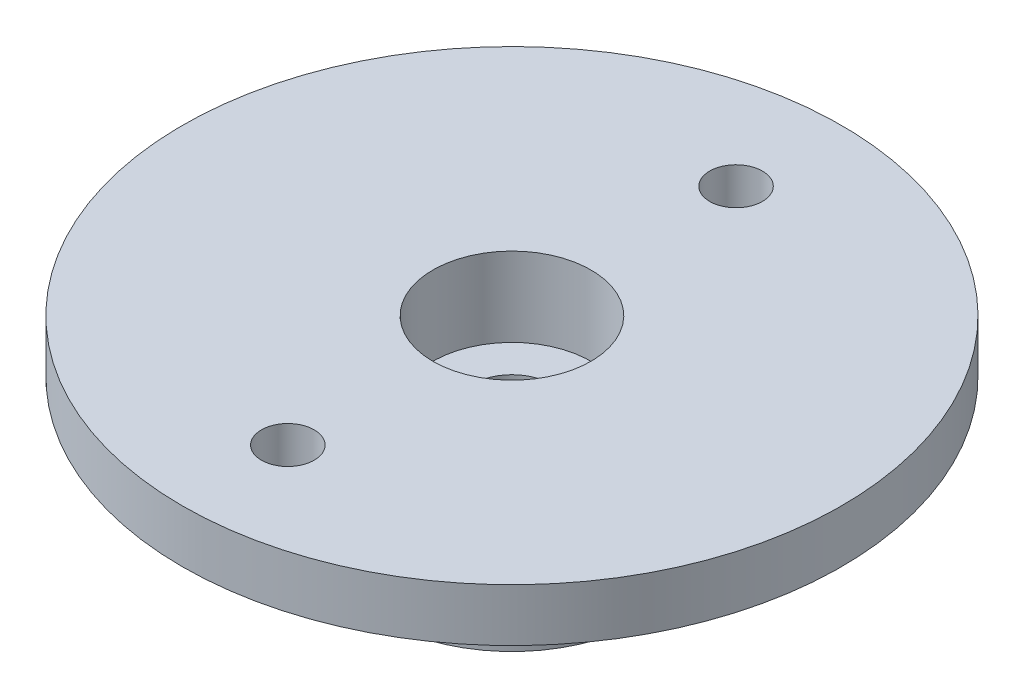
ISO-10303-21;
HEADER;
FILE_DESCRIPTION(('STEP AP214'),'2;1');
FILE_NAME('part.step','',(''),(''),'','','');
FILE_SCHEMA(('AUTOMOTIVE_DESIGN { 1 0 10303 214 1 1 1 1 }'));
ENDSEC;
DATA;
#1=APPLICATION_CONTEXT('core data for automotive mechanical design processes');
#2=APPLICATION_PROTOCOL_DEFINITION('international standard','automotive_design',2000,#1);
#3=PRODUCT_CONTEXT('',#1,'mechanical');
#4=PRODUCT('Part','Part','',(#3));
#5=PRODUCT_RELATED_PRODUCT_CATEGORY('part','',(#4));
#6=PRODUCT_DEFINITION_FORMATION('','',#4);
#7=PRODUCT_DEFINITION_CONTEXT('part definition',#1,'design');
#8=PRODUCT_DEFINITION('design','',#6,#7);
#9=PRODUCT_DEFINITION_SHAPE('','',#8);
#10=(LENGTH_UNIT() NAMED_UNIT(*) SI_UNIT(.MILLI.,.METRE.));
#11=(NAMED_UNIT(*) PLANE_ANGLE_UNIT() SI_UNIT($,.RADIAN.));
#12=(NAMED_UNIT(*) SI_UNIT($,.STERADIAN.) SOLID_ANGLE_UNIT());
#13=UNCERTAINTY_MEASURE_WITH_UNIT(LENGTH_MEASURE(1.E-05),#10,'distance_accuracy_value','');
#14=(GEOMETRIC_REPRESENTATION_CONTEXT(3) GLOBAL_UNCERTAINTY_ASSIGNED_CONTEXT((#13)) GLOBAL_UNIT_ASSIGNED_CONTEXT((#10,
#11,#12)) REPRESENTATION_CONTEXT('',''));
#15=CARTESIAN_POINT('',(0.,0.,0.));
#16=DIRECTION('',(0.,0.,1.));
#17=DIRECTION('',(1.,0.,0.));
#18=AXIS2_PLACEMENT_3D('',#15,#16,#17);
#19=CARTESIAN_POINT('',(0.,0.,0.));
#20=DIRECTION('',(0.,1.,0.));
#21=DIRECTION('',(0.,0.,1.));
#22=AXIS2_PLACEMENT_3D('',#19,#20,#21);
#23=PLANE('',#22);
#24=CARTESIAN_POINT('',(0.,0.,8.5));
#25=DIRECTION('',(0.,1.,0.));
#26=DIRECTION('',(0.,0.,1.));
#27=AXIS2_PLACEMENT_3D('',#24,#25,#26);
#28=CIRCLE('',#27,1.);
#29=CARTESIAN_POINT('',(0.,0.,9.5));
#30=VERTEX_POINT('',#29);
#31=EDGE_CURVE('E64',#30,#30,#28,.F.);
#32=ORIENTED_EDGE('',*,*,#31,.F.);
#33=EDGE_LOOP('',(#32));
#34=FACE_BOUND('',#33,.T.);
#35=CARTESIAN_POINT('',(0.,0.,-8.5));
#36=DIRECTION('',(0.,1.,0.));
#37=DIRECTION('',(0.,0.,1.));
#38=AXIS2_PLACEMENT_3D('',#35,#36,#37);
#39=CIRCLE('',#38,1.);
#40=CARTESIAN_POINT('',(0.,0.,-7.5));
#41=VERTEX_POINT('',#40);
#42=EDGE_CURVE('E56',#41,#41,#39,.F.);
#43=ORIENTED_EDGE('',*,*,#42,.F.);
#44=EDGE_LOOP('',(#43));
#45=FACE_BOUND('',#44,.T.);
#46=CARTESIAN_POINT('',(0.,0.,0.));
#47=DIRECTION('',(0.,1.,0.));
#48=DIRECTION('',(0.,0.,1.));
#49=AXIS2_PLACEMENT_3D('',#46,#47,#48);
#50=CIRCLE('',#49,12.5);
#51=CARTESIAN_POINT('',(0.,0.,12.5));
#52=VERTEX_POINT('',#51);
#53=EDGE_CURVE('E43',#52,#52,#50,.T.);
#54=ORIENTED_EDGE('',*,*,#53,.F.);
#55=EDGE_LOOP('',(#54));
#56=FACE_BOUND('',#55,.T.);
#57=CARTESIAN_POINT('',(0.,0.,0.));
#58=DIRECTION('',(0.,1.,0.));
#59=DIRECTION('',(0.,0.,1.));
#60=AXIS2_PLACEMENT_3D('',#57,#58,#59);
#61=CIRCLE('',#60,5.);
#62=CARTESIAN_POINT('',(0.,0.,5.));
#63=VERTEX_POINT('',#62);
#64=EDGE_CURVE('E11',#63,#63,#61,.F.);
#65=ORIENTED_EDGE('',*,*,#64,.F.);
#66=EDGE_LOOP('',(#65));
#67=FACE_BOUND('',#66,.T.);
#68=ADVANCED_FACE('F32',(#34,#45,#56,#67),#23,.F.);
#69=CARTESIAN_POINT('',(0.,2.,0.));
#70=DIRECTION('',(0.,-1.,0.));
#71=DIRECTION('',(0.,0.,-1.));
#72=AXIS2_PLACEMENT_3D('',#69,#70,#71);
#73=CYLINDRICAL_SURFACE('',#72,12.5);
#74=CARTESIAN_POINT('',(0.,2.,0.));
#75=DIRECTION('',(0.,1.,0.));
#76=DIRECTION('',(0.,0.,1.));
#77=AXIS2_PLACEMENT_3D('',#74,#75,#76);
#78=CIRCLE('',#77,12.5);
#79=CARTESIAN_POINT('',(0.,2.,12.5));
#80=VERTEX_POINT('',#79);
#81=EDGE_CURVE('E39',#80,#80,#78,.T.);
#82=ORIENTED_EDGE('',*,*,#81,.F.);
#83=EDGE_LOOP('',(#82));
#84=FACE_BOUND('',#83,.T.);
#85=ORIENTED_EDGE('',*,*,#53,.T.);
#86=EDGE_LOOP('',(#85));
#87=FACE_BOUND('',#86,.T.);
#88=ADVANCED_FACE('F34',(#84,#87),#73,.T.);
#89=CARTESIAN_POINT('',(0.,2.,0.));
#90=DIRECTION('',(0.,1.,0.));
#91=DIRECTION('',(0.,0.,1.));
#92=AXIS2_PLACEMENT_3D('',#89,#90,#91);
#93=PLANE('',#92);
#94=CARTESIAN_POINT('',(0.,2.,0.));
#95=DIRECTION('',(0.,1.,0.));
#96=DIRECTION('',(0.,0.,1.));
#97=AXIS2_PLACEMENT_3D('',#94,#95,#96);
#98=CIRCLE('',#97,3.);
#99=CARTESIAN_POINT('',(0.,2.,3.));
#100=VERTEX_POINT('',#99);
#101=EDGE_CURVE('E73',#100,#100,#98,.T.);
#102=ORIENTED_EDGE('',*,*,#101,.F.);
#103=EDGE_LOOP('',(#102));
#104=FACE_BOUND('',#103,.T.);
#105=CARTESIAN_POINT('',(0.,2.,8.5));
#106=DIRECTION('',(0.,1.,0.));
#107=DIRECTION('',(0.,0.,1.));
#108=AXIS2_PLACEMENT_3D('',#105,#106,#107);
#109=CIRCLE('',#108,1.);
#110=CARTESIAN_POINT('',(0.,2.,9.5));
#111=VERTEX_POINT('',#110);
#112=EDGE_CURVE('E67',#111,#111,#109,.T.);
#113=ORIENTED_EDGE('',*,*,#112,.F.);
#114=EDGE_LOOP('',(#113));
#115=FACE_BOUND('',#114,.T.);
#116=CARTESIAN_POINT('',(0.,2.,-8.5));
#117=DIRECTION('',(0.,1.,0.));
#118=DIRECTION('',(0.,0.,1.));
#119=AXIS2_PLACEMENT_3D('',#116,#117,#118);
#120=CIRCLE('',#119,1.);
#121=CARTESIAN_POINT('',(0.,2.,-7.5));
#122=VERTEX_POINT('',#121);
#123=EDGE_CURVE('E61',#122,#122,#120,.T.);
#124=ORIENTED_EDGE('',*,*,#123,.F.);
#125=EDGE_LOOP('',(#124));
#126=FACE_BOUND('',#125,.T.);
#127=ORIENTED_EDGE('',*,*,#81,.T.);
#128=EDGE_LOOP('',(#127));
#129=FACE_BOUND('',#128,.T.);
#130=ADVANCED_FACE('F106',(#104,#115,#126,#129),#93,.T.);
#131=CARTESIAN_POINT('',(0.,-5.5,0.));
#132=DIRECTION('',(0.,1.,0.));
#133=DIRECTION('',(0.,0.,1.));
#134=AXIS2_PLACEMENT_3D('',#131,#132,#133);
#135=CYLINDRICAL_SURFACE('',#134,5.);
#136=CARTESIAN_POINT('',(0.,-5.5,0.));
#137=DIRECTION('',(0.,-1.,0.));
#138=DIRECTION('',(0.,0.,-1.));
#139=AXIS2_PLACEMENT_3D('',#136,#137,#138);
#140=CIRCLE('',#139,5.);
#141=CARTESIAN_POINT('',(0.,-5.5,-5.));
#142=VERTEX_POINT('',#141);
#143=EDGE_CURVE('E48',#142,#142,#140,.T.);
#144=ORIENTED_EDGE('',*,*,#143,.F.);
#145=EDGE_LOOP('',(#144));
#146=FACE_BOUND('',#145,.T.);
#147=ORIENTED_EDGE('',*,*,#64,.T.);
#148=EDGE_LOOP('',(#147));
#149=FACE_BOUND('',#148,.T.);
#150=ADVANCED_FACE('F113',(#146,#149),#135,.T.);
#151=CARTESIAN_POINT('',(0.,-5.5,0.));
#152=DIRECTION('',(0.,-1.,0.));
#153=DIRECTION('',(0.,0.,-1.));
#154=AXIS2_PLACEMENT_3D('',#151,#152,#153);
#155=PLANE('',#154);
#156=CARTESIAN_POINT('',(0.,-5.5,0.));
#157=DIRECTION('',(0.,-1.,0.));
#158=DIRECTION('',(0.,0.,-1.));
#159=AXIS2_PLACEMENT_3D('',#156,#157,#158);
#160=CIRCLE('',#159,2.75);
#161=CARTESIAN_POINT('',(0.,-5.5,-2.75));
#162=VERTEX_POINT('',#161);
#163=EDGE_CURVE('E53',#162,#162,#160,.T.);
#164=ORIENTED_EDGE('',*,*,#163,.F.);
#165=EDGE_LOOP('',(#164));
#166=FACE_BOUND('',#165,.T.);
#167=ORIENTED_EDGE('',*,*,#143,.T.);
#168=EDGE_LOOP('',(#167));
#169=FACE_BOUND('',#168,.T.);
#170=ADVANCED_FACE('F117',(#166,#169),#155,.T.);
#171=CARTESIAN_POINT('',(0.,-2.5,0.));
#172=DIRECTION('',(0.,-1.,0.));
#173=DIRECTION('',(0.,0.,-1.));
#174=AXIS2_PLACEMENT_3D('',#171,#172,#173);
#175=CYLINDRICAL_SURFACE('',#174,2.75);
#176=CARTESIAN_POINT('',(0.,-2.5,0.));
#177=DIRECTION('',(0.,-1.,0.));
#178=DIRECTION('',(0.,0.,-1.));
#179=AXIS2_PLACEMENT_3D('',#176,#177,#178);
#180=CIRCLE('',#179,2.75);
#181=CARTESIAN_POINT('',(0.,-2.5,-2.75));
#182=VERTEX_POINT('',#181);
#183=EDGE_CURVE('E52',#182,#182,#180,.T.);
#184=ORIENTED_EDGE('',*,*,#183,.F.);
#185=EDGE_LOOP('',(#184));
#186=FACE_BOUND('',#185,.T.);
#187=ORIENTED_EDGE('',*,*,#163,.T.);
#188=EDGE_LOOP('',(#187));
#189=FACE_BOUND('',#188,.T.);
#190=ADVANCED_FACE('F121',(#186,#189),#175,.F.);
#191=CARTESIAN_POINT('',(0.,-2.5,0.));
#192=DIRECTION('',(0.,-1.,0.));
#193=DIRECTION('',(0.,0.,-1.));
#194=AXIS2_PLACEMENT_3D('',#191,#192,#193);
#195=PLANE('',#194);
#196=CARTESIAN_POINT('',(0.,-2.5,0.));
#197=DIRECTION('',(0.,-1.,0.));
#198=DIRECTION('',(0.,0.,-1.));
#199=AXIS2_PLACEMENT_3D('',#196,#197,#198);
#200=CIRCLE('',#199,1.5);
#201=CARTESIAN_POINT('',(0.,-2.5,-1.5));
#202=VERTEX_POINT('',#201);
#203=EDGE_CURVE('E77',#202,#202,#200,.F.);
#204=ORIENTED_EDGE('',*,*,#203,.T.);
#205=EDGE_LOOP('',(#204));
#206=FACE_BOUND('',#205,.T.);
#207=ORIENTED_EDGE('',*,*,#183,.T.);
#208=EDGE_LOOP('',(#207));
#209=FACE_BOUND('',#208,.T.);
#210=ADVANCED_FACE('F125',(#206,#209),#195,.T.);
#211=CARTESIAN_POINT('',(0.,-5.501,-8.5));
#212=DIRECTION('',(0.,1.,0.));
#213=DIRECTION('',(0.,0.,1.));
#214=AXIS2_PLACEMENT_3D('',#211,#212,#213);
#215=CYLINDRICAL_SURFACE('',#214,1.);
#216=CARTESIAN_POINT('',(0.,2.,-7.5));
#217=CARTESIAN_POINT('',(0.,1.97916666666667,-7.5));
#218=CARTESIAN_POINT('',(0.,1.95833333333333,-7.5));
#219=CARTESIAN_POINT('',(0.,1.91666666666667,-7.5));
#220=CARTESIAN_POINT('',(0.,1.89583333333333,-7.5));
#221=CARTESIAN_POINT('',(0.,1.85416666666667,-7.5));
#222=CARTESIAN_POINT('',(0.,1.83333333333333,-7.5));
#223=CARTESIAN_POINT('',(0.,1.79166666666667,-7.5));
#224=CARTESIAN_POINT('',(0.,1.77083333333333,-7.5));
#225=CARTESIAN_POINT('',(0.,1.72916666666667,-7.5));
#226=CARTESIAN_POINT('',(0.,1.70833333333333,-7.5));
#227=CARTESIAN_POINT('',(0.,1.66666666666667,-7.5));
#228=CARTESIAN_POINT('',(0.,1.64583333333333,-7.5));
#229=CARTESIAN_POINT('',(0.,1.60416666666667,-7.5));
#230=CARTESIAN_POINT('',(0.,1.58333333333333,-7.5));
#231=CARTESIAN_POINT('',(0.,1.54166666666667,-7.5));
#232=CARTESIAN_POINT('',(0.,1.52083333333333,-7.5));
#233=CARTESIAN_POINT('',(0.,1.47916666666667,-7.5));
#234=CARTESIAN_POINT('',(0.,1.45833333333333,-7.5));
#235=CARTESIAN_POINT('',(0.,1.41666666666667,-7.5));
#236=CARTESIAN_POINT('',(0.,1.39583333333333,-7.5));
#237=CARTESIAN_POINT('',(0.,1.35416666666667,-7.5));
#238=CARTESIAN_POINT('',(0.,1.33333333333333,-7.5));
#239=CARTESIAN_POINT('',(0.,1.29166666666667,-7.5));
#240=CARTESIAN_POINT('',(0.,1.27083333333333,-7.5));
#241=CARTESIAN_POINT('',(0.,1.22916666666667,-7.5));
#242=CARTESIAN_POINT('',(0.,1.20833333333333,-7.5));
#243=CARTESIAN_POINT('',(0.,1.16666666666667,-7.5));
#244=CARTESIAN_POINT('',(0.,1.14583333333333,-7.5));
#245=CARTESIAN_POINT('',(0.,1.10416666666667,-7.5));
#246=CARTESIAN_POINT('',(0.,1.08333333333333,-7.5));
#247=CARTESIAN_POINT('',(0.,1.04166666666667,-7.5));
#248=CARTESIAN_POINT('',(0.,1.02083333333333,-7.5));
#249=CARTESIAN_POINT('',(0.,0.979166666666667,-7.5));
#250=CARTESIAN_POINT('',(0.,0.958333333333333,-7.5));
#251=CARTESIAN_POINT('',(0.,0.916666666666667,-7.5));
#252=CARTESIAN_POINT('',(0.,0.895833333333333,-7.5));
#253=CARTESIAN_POINT('',(0.,0.854166666666667,-7.5));
#254=CARTESIAN_POINT('',(0.,0.833333333333333,-7.5));
#255=CARTESIAN_POINT('',(0.,0.791666666666667,-7.5));
#256=CARTESIAN_POINT('',(0.,0.770833333333333,-7.5));
#257=CARTESIAN_POINT('',(0.,0.729166666666667,-7.5));
#258=CARTESIAN_POINT('',(0.,0.708333333333333,-7.5));
#259=CARTESIAN_POINT('',(0.,0.666666666666667,-7.5));
#260=CARTESIAN_POINT('',(0.,0.645833333333334,-7.5));
#261=CARTESIAN_POINT('',(0.,0.604166666666667,-7.5));
#262=CARTESIAN_POINT('',(0.,0.583333333333334,-7.5));
#263=CARTESIAN_POINT('',(0.,0.541666666666667,-7.5));
#264=CARTESIAN_POINT('',(0.,0.520833333333334,-7.5));
#265=CARTESIAN_POINT('',(0.,0.479166666666667,-7.5));
#266=CARTESIAN_POINT('',(0.,0.458333333333334,-7.5));
#267=CARTESIAN_POINT('',(0.,0.416666666666667,-7.5));
#268=CARTESIAN_POINT('',(0.,0.395833333333334,-7.5));
#269=CARTESIAN_POINT('',(0.,0.354166666666667,-7.5));
#270=CARTESIAN_POINT('',(0.,0.333333333333334,-7.5));
#271=CARTESIAN_POINT('',(0.,0.291666666666667,-7.5));
#272=CARTESIAN_POINT('',(0.,0.270833333333334,-7.5));
#273=CARTESIAN_POINT('',(0.,0.229166666666667,-7.5));
#274=CARTESIAN_POINT('',(0.,0.208333333333334,-7.5));
#275=CARTESIAN_POINT('',(0.,0.166666666666667,-7.5));
#276=CARTESIAN_POINT('',(0.,0.145833333333333,-7.5));
#277=CARTESIAN_POINT('',(0.,0.104166666666667,-7.5));
#278=CARTESIAN_POINT('',(0.,0.0833333333333334,-7.5));
#279=CARTESIAN_POINT('',(0.,0.0416666666666667,-7.5));
#280=CARTESIAN_POINT('',(0.,0.0208333333333333,-7.5));
#281=CARTESIAN_POINT('',(0.,0.,-7.5));
#282=B_SPLINE_CURVE_WITH_KNOTS('',3,(#216,#217,#218,#219,#220,#221,#222,#223,#224,#225,#226,
#227,#228,#229,#230,#231,#232,#233,#234,#235,#236,#237,#238,#239,#240,#241,#242,#243,#244,#245,
#246,#247,#248,#249,#250,#251,#252,#253,#254,#255,#256,#257,#258,#259,#260,#261,#262,#263,#264,
#265,#266,#267,#268,#269,#270,#271,#272,#273,#274,#275,#276,#277,#278,#279,#280,#281),
.UNSPECIFIED.,.F.,.F.,(4,2,2,2,2,2,2,2,2,2,2,2,2,2,2,2,2,2,2,2,2,2,2,2,2,2,2,2,2,2,2,2,4),(0.,
0.0625000000000001,0.125,0.1875,0.25,0.3125,0.375,0.4375,0.5,0.5625,0.625,0.6875,0.75,0.8125,
0.875,0.9375,1.,1.0625,1.125,1.1875,1.25,1.3125,1.375,1.4375,1.5,1.5625,1.625,1.6875,1.75,
1.8125,1.875,1.9375,2.),.UNSPECIFIED.);
#283=EDGE_CURVE('BSEAM129',#122,#41,#282,.T.);
#284=ORIENTED_EDGE('',*,*,#123,.T.);
#285=ORIENTED_EDGE('',*,*,#42,.T.);
#286=ORIENTED_EDGE('',*,*,#283,.T.);
#287=ORIENTED_EDGE('',*,*,#283,.F.);
#288=EDGE_LOOP('',(#284,#286,#285,#287));
#289=FACE_BOUND('',#288,.T.);
#290=ADVANCED_FACE('F129',(#289),#215,.F.);
#291=CARTESIAN_POINT('',(0.,-5.501,8.5));
#292=DIRECTION('',(0.,1.,0.));
#293=DIRECTION('',(0.,0.,1.));
#294=AXIS2_PLACEMENT_3D('',#291,#292,#293);
#295=CYLINDRICAL_SURFACE('',#294,1.);
#296=CARTESIAN_POINT('',(0.,2.,9.5));
#297=CARTESIAN_POINT('',(0.,1.97916666666667,9.5));
#298=CARTESIAN_POINT('',(0.,1.95833333333333,9.5));
#299=CARTESIAN_POINT('',(0.,1.91666666666667,9.5));
#300=CARTESIAN_POINT('',(0.,1.89583333333333,9.5));
#301=CARTESIAN_POINT('',(0.,1.85416666666667,9.5));
#302=CARTESIAN_POINT('',(0.,1.83333333333333,9.5));
#303=CARTESIAN_POINT('',(0.,1.79166666666667,9.5));
#304=CARTESIAN_POINT('',(0.,1.77083333333333,9.5));
#305=CARTESIAN_POINT('',(0.,1.72916666666667,9.5));
#306=CARTESIAN_POINT('',(0.,1.70833333333333,9.5));
#307=CARTESIAN_POINT('',(0.,1.66666666666667,9.5));
#308=CARTESIAN_POINT('',(0.,1.64583333333333,9.5));
#309=CARTESIAN_POINT('',(0.,1.60416666666667,9.5));
#310=CARTESIAN_POINT('',(0.,1.58333333333333,9.5));
#311=CARTESIAN_POINT('',(0.,1.54166666666667,9.5));
#312=CARTESIAN_POINT('',(0.,1.52083333333333,9.5));
#313=CARTESIAN_POINT('',(0.,1.47916666666667,9.5));
#314=CARTESIAN_POINT('',(0.,1.45833333333333,9.5));
#315=CARTESIAN_POINT('',(0.,1.41666666666667,9.5));
#316=CARTESIAN_POINT('',(0.,1.39583333333333,9.5));
#317=CARTESIAN_POINT('',(0.,1.35416666666667,9.5));
#318=CARTESIAN_POINT('',(0.,1.33333333333333,9.5));
#319=CARTESIAN_POINT('',(0.,1.29166666666667,9.5));
#320=CARTESIAN_POINT('',(0.,1.27083333333333,9.5));
#321=CARTESIAN_POINT('',(0.,1.22916666666667,9.5));
#322=CARTESIAN_POINT('',(0.,1.20833333333333,9.5));
#323=CARTESIAN_POINT('',(0.,1.16666666666667,9.5));
#324=CARTESIAN_POINT('',(0.,1.14583333333333,9.5));
#325=CARTESIAN_POINT('',(0.,1.10416666666667,9.5));
#326=CARTESIAN_POINT('',(0.,1.08333333333333,9.5));
#327=CARTESIAN_POINT('',(0.,1.04166666666667,9.5));
#328=CARTESIAN_POINT('',(0.,1.02083333333333,9.5));
#329=CARTESIAN_POINT('',(0.,0.979166666666667,9.5));
#330=CARTESIAN_POINT('',(0.,0.958333333333333,9.5));
#331=CARTESIAN_POINT('',(0.,0.916666666666667,9.5));
#332=CARTESIAN_POINT('',(0.,0.895833333333333,9.5));
#333=CARTESIAN_POINT('',(0.,0.854166666666667,9.5));
#334=CARTESIAN_POINT('',(0.,0.833333333333333,9.5));
#335=CARTESIAN_POINT('',(0.,0.791666666666667,9.5));
#336=CARTESIAN_POINT('',(0.,0.770833333333333,9.5));
#337=CARTESIAN_POINT('',(0.,0.729166666666667,9.5));
#338=CARTESIAN_POINT('',(0.,0.708333333333333,9.5));
#339=CARTESIAN_POINT('',(0.,0.666666666666667,9.5));
#340=CARTESIAN_POINT('',(0.,0.645833333333334,9.5));
#341=CARTESIAN_POINT('',(0.,0.604166666666667,9.5));
#342=CARTESIAN_POINT('',(0.,0.583333333333334,9.5));
#343=CARTESIAN_POINT('',(0.,0.541666666666667,9.5));
#344=CARTESIAN_POINT('',(0.,0.520833333333334,9.5));
#345=CARTESIAN_POINT('',(0.,0.479166666666667,9.5));
#346=CARTESIAN_POINT('',(0.,0.458333333333334,9.5));
#347=CARTESIAN_POINT('',(0.,0.416666666666667,9.5));
#348=CARTESIAN_POINT('',(0.,0.395833333333334,9.5));
#349=CARTESIAN_POINT('',(0.,0.354166666666667,9.5));
#350=CARTESIAN_POINT('',(0.,0.333333333333334,9.5));
#351=CARTESIAN_POINT('',(0.,0.291666666666667,9.5));
#352=CARTESIAN_POINT('',(0.,0.270833333333334,9.5));
#353=CARTESIAN_POINT('',(0.,0.229166666666667,9.5));
#354=CARTESIAN_POINT('',(0.,0.208333333333334,9.5));
#355=CARTESIAN_POINT('',(0.,0.166666666666667,9.5));
#356=CARTESIAN_POINT('',(0.,0.145833333333333,9.5));
#357=CARTESIAN_POINT('',(0.,0.104166666666667,9.5));
#358=CARTESIAN_POINT('',(0.,0.0833333333333334,9.5));
#359=CARTESIAN_POINT('',(0.,0.0416666666666667,9.5));
#360=CARTESIAN_POINT('',(0.,0.0208333333333333,9.5));
#361=CARTESIAN_POINT('',(0.,0.,9.5));
#362=B_SPLINE_CURVE_WITH_KNOTS('',3,(#296,#297,#298,#299,#300,#301,#302,#303,#304,#305,#306,
#307,#308,#309,#310,#311,#312,#313,#314,#315,#316,#317,#318,#319,#320,#321,#322,#323,#324,#325,
#326,#327,#328,#329,#330,#331,#332,#333,#334,#335,#336,#337,#338,#339,#340,#341,#342,#343,#344,
#345,#346,#347,#348,#349,#350,#351,#352,#353,#354,#355,#356,#357,#358,#359,#360,#361),
.UNSPECIFIED.,.F.,.F.,(4,2,2,2,2,2,2,2,2,2,2,2,2,2,2,2,2,2,2,2,2,2,2,2,2,2,2,2,2,2,2,2,4),(0.,
0.0625000000000001,0.125,0.1875,0.25,0.3125,0.375,0.4375,0.5,0.5625,0.625,0.6875,0.75,0.8125,
0.875,0.9375,1.,1.0625,1.125,1.1875,1.25,1.3125,1.375,1.4375,1.5,1.5625,1.625,1.6875,1.75,
1.8125,1.875,1.9375,2.),.UNSPECIFIED.);
#363=EDGE_CURVE('BSEAM89',#111,#30,#362,.T.);
#364=ORIENTED_EDGE('',*,*,#112,.T.);
#365=ORIENTED_EDGE('',*,*,#31,.T.);
#366=ORIENTED_EDGE('',*,*,#363,.T.);
#367=ORIENTED_EDGE('',*,*,#363,.F.);
#368=EDGE_LOOP('',(#364,#366,#365,#367));
#369=FACE_BOUND('',#368,.T.);
#370=ADVANCED_FACE('F89',(#369),#295,.F.);
#371=CARTESIAN_POINT('',(0.,-1.,0.));
#372=DIRECTION('',(0.,-1.,0.));
#373=DIRECTION('',(0.,0.,-1.));
#374=AXIS2_PLACEMENT_3D('',#371,#372,#373);
#375=PLANE('',#374);
#376=CARTESIAN_POINT('',(0.,-1.,0.));
#377=DIRECTION('',(0.,1.,0.));
#378=DIRECTION('',(0.,0.,1.));
#379=AXIS2_PLACEMENT_3D('',#376,#377,#378);
#380=CIRCLE('',#379,1.5);
#381=CARTESIAN_POINT('',(0.,-1.,1.5));
#382=VERTEX_POINT('',#381);
#383=EDGE_CURVE('E76',#382,#382,#380,.T.);
#384=ORIENTED_EDGE('',*,*,#383,.F.);
#385=EDGE_LOOP('',(#384));
#386=FACE_BOUND('',#385,.T.);
#387=CARTESIAN_POINT('',(0.,-0.999999999999999,0.));
#388=DIRECTION('',(0.,-1.,0.));
#389=DIRECTION('',(0.,0.,-1.));
#390=AXIS2_PLACEMENT_3D('',#387,#388,#389);
#391=CIRCLE('',#390,3.);
#392=CARTESIAN_POINT('',(0.,-0.999999999999999,3.));
#393=VERTEX_POINT('',#392);
#394=EDGE_CURVE('E70',#393,#393,#391,.F.);
#395=ORIENTED_EDGE('',*,*,#394,.T.);
#396=EDGE_LOOP('',(#395));
#397=FACE_BOUND('',#396,.T.);
#398=ADVANCED_FACE('F85',(#386,#397),#375,.F.);
#399=CARTESIAN_POINT('',(0.,-10.9852813742386,0.));
#400=DIRECTION('',(0.,1.,0.));
#401=DIRECTION('',(0.,0.,1.));
#402=AXIS2_PLACEMENT_3D('',#399,#400,#401);
#403=CYLINDRICAL_SURFACE('',#402,3.);
#404=CARTESIAN_POINT('',(0.,2.,3.));
#405=CARTESIAN_POINT('',(0.,1.96875,3.));
#406=CARTESIAN_POINT('',(0.,1.9375,3.));
#407=CARTESIAN_POINT('',(0.,1.875,3.));
#408=CARTESIAN_POINT('',(0.,1.84375,3.));
#409=CARTESIAN_POINT('',(0.,1.78125,3.));
#410=CARTESIAN_POINT('',(0.,1.75,3.));
#411=CARTESIAN_POINT('',(0.,1.6875,3.));
#412=CARTESIAN_POINT('',(0.,1.65625,3.));
#413=CARTESIAN_POINT('',(0.,1.59375,3.));
#414=CARTESIAN_POINT('',(0.,1.5625,3.));
#415=CARTESIAN_POINT('',(0.,1.5,3.));
#416=CARTESIAN_POINT('',(0.,1.46875,3.));
#417=CARTESIAN_POINT('',(0.,1.40625,3.));
#418=CARTESIAN_POINT('',(0.,1.375,3.));
#419=CARTESIAN_POINT('',(0.,1.3125,3.));
#420=CARTESIAN_POINT('',(0.,1.28125,3.));
#421=CARTESIAN_POINT('',(0.,1.21875,3.));
#422=CARTESIAN_POINT('',(0.,1.1875,3.));
#423=CARTESIAN_POINT('',(0.,1.125,3.));
#424=CARTESIAN_POINT('',(0.,1.09375,3.));
#425=CARTESIAN_POINT('',(0.,1.03125,3.));
#426=CARTESIAN_POINT('',(0.,1.,3.));
#427=CARTESIAN_POINT('',(0.,0.937500000000001,3.));
#428=CARTESIAN_POINT('',(0.,0.906250000000001,3.));
#429=CARTESIAN_POINT('',(0.,0.843750000000001,3.));
#430=CARTESIAN_POINT('',(0.,0.812500000000001,3.));
#431=CARTESIAN_POINT('',(0.,0.750000000000001,3.));
#432=CARTESIAN_POINT('',(0.,0.718750000000001,3.));
#433=CARTESIAN_POINT('',(0.,0.656250000000001,3.));
#434=CARTESIAN_POINT('',(0.,0.625000000000001,3.));
#435=CARTESIAN_POINT('',(0.,0.5625,3.));
#436=CARTESIAN_POINT('',(0.,0.53125,3.));
#437=CARTESIAN_POINT('',(0.,0.46875,3.));
#438=CARTESIAN_POINT('',(0.,0.4375,3.));
#439=CARTESIAN_POINT('',(0.,0.375,3.));
#440=CARTESIAN_POINT('',(0.,0.34375,3.));
#441=CARTESIAN_POINT('',(0.,0.28125,3.));
#442=CARTESIAN_POINT('',(0.,0.25,3.));
#443=CARTESIAN_POINT('',(0.,0.1875,3.));
#444=CARTESIAN_POINT('',(0.,0.15625,3.));
#445=CARTESIAN_POINT('',(0.,0.0937500000000001,3.));
#446=CARTESIAN_POINT('',(0.,0.0625000000000001,3.));
#447=CARTESIAN_POINT('',(0.,0.,3.));
#448=CARTESIAN_POINT('',(0.,-0.0312499999999989,3.));
#449=CARTESIAN_POINT('',(0.,-0.0937499999999983,3.));
#450=CARTESIAN_POINT('',(0.,-0.124999999999998,3.));
#451=CARTESIAN_POINT('',(0.,-0.187499999999998,3.));
#452=CARTESIAN_POINT('',(0.,-0.218749999999998,3.));
#453=CARTESIAN_POINT('',(0.,-0.281249999999999,3.));
#454=CARTESIAN_POINT('',(0.,-0.312499999999999,3.));
#455=CARTESIAN_POINT('',(0.,-0.374999999999999,3.));
#456=CARTESIAN_POINT('',(0.,-0.406249999999999,3.));
#457=CARTESIAN_POINT('',(0.,-0.468749999999999,3.));
#458=CARTESIAN_POINT('',(0.,-0.499999999999999,3.));
#459=CARTESIAN_POINT('',(0.,-0.562499999999999,3.));
#460=CARTESIAN_POINT('',(0.,-0.593749999999999,3.));
#461=CARTESIAN_POINT('',(0.,-0.656249999999999,3.));
#462=CARTESIAN_POINT('',(0.,-0.687499999999999,3.));
#463=CARTESIAN_POINT('',(0.,-0.749999999999999,3.));
#464=CARTESIAN_POINT('',(0.,-0.781249999999999,3.));
#465=CARTESIAN_POINT('',(0.,-0.843749999999999,3.));
#466=CARTESIAN_POINT('',(0.,-0.874999999999999,3.));
#467=CARTESIAN_POINT('',(0.,-0.937499999999999,3.));
#468=CARTESIAN_POINT('',(0.,-0.968749999999999,3.));
#469=CARTESIAN_POINT('',(0.,-0.999999999999999,3.));
#470=B_SPLINE_CURVE_WITH_KNOTS('',3,(#404,#405,#406,#407,#408,#409,#410,#411,#412,#413,#414,
#415,#416,#417,#418,#419,#420,#421,#422,#423,#424,#425,#426,#427,#428,#429,#430,#431,#432,#433,
#434,#435,#436,#437,#438,#439,#440,#441,#442,#443,#444,#445,#446,#447,#448,#449,#450,#451,#452,
#453,#454,#455,#456,#457,#458,#459,#460,#461,#462,#463,#464,#465,#466,#467,#468,#469),
.UNSPECIFIED.,.F.,.F.,(4,2,2,2,2,2,2,2,2,2,2,2,2,2,2,2,2,2,2,2,2,2,2,2,2,2,2,2,2,2,2,2,4),(0.,
0.0937500000000001,0.1875,0.28125,0.375,0.46875,0.5625,0.656250000000001,0.750000000000001,
0.843749999999999,0.937499999999999,1.03125,1.125,1.21875,1.3125,1.40625,1.5,1.59375,1.6875,
1.78125,1.875,1.96875,2.0625,2.15625,2.25,2.34375,2.4375,2.53125,2.625,2.71875,2.8125,2.90625,
3.),.UNSPECIFIED.);
#471=EDGE_CURVE('BSEAM88',#100,#393,#470,.T.);
#472=ORIENTED_EDGE('',*,*,#101,.T.);
#473=ORIENTED_EDGE('',*,*,#394,.F.);
#474=ORIENTED_EDGE('',*,*,#471,.T.);
#475=ORIENTED_EDGE('',*,*,#471,.F.);
#476=EDGE_LOOP('',(#472,#474,#473,#475));
#477=FACE_BOUND('',#476,.T.);
#478=ADVANCED_FACE('F88',(#477),#403,.F.);
#479=CARTESIAN_POINT('',(0.,-5.501,0.));
#480=DIRECTION('',(0.,1.,0.));
#481=DIRECTION('',(0.,0.,1.));
#482=AXIS2_PLACEMENT_3D('',#479,#480,#481);
#483=CYLINDRICAL_SURFACE('',#482,1.5);
#484=ORIENTED_EDGE('',*,*,#203,.F.);
#485=EDGE_LOOP('',(#484));
#486=FACE_BOUND('',#485,.T.);
#487=ORIENTED_EDGE('',*,*,#383,.T.);
#488=EDGE_LOOP('',(#487));
#489=FACE_BOUND('',#488,.T.);
#490=ADVANCED_FACE('F83',(#486,#489),#483,.F.);
#491=CLOSED_SHELL('',(#68,#88,#130,#150,#170,#190,#210,#290,#370,#398,#478,#490));
#492=MANIFOLD_SOLID_BREP('B2',#491);
#493=ADVANCED_BREP_SHAPE_REPRESENTATION('',(#18,#492),#14);
#494=SHAPE_DEFINITION_REPRESENTATION(#9,#493);
ENDSEC;
END-ISO-10303-21;
